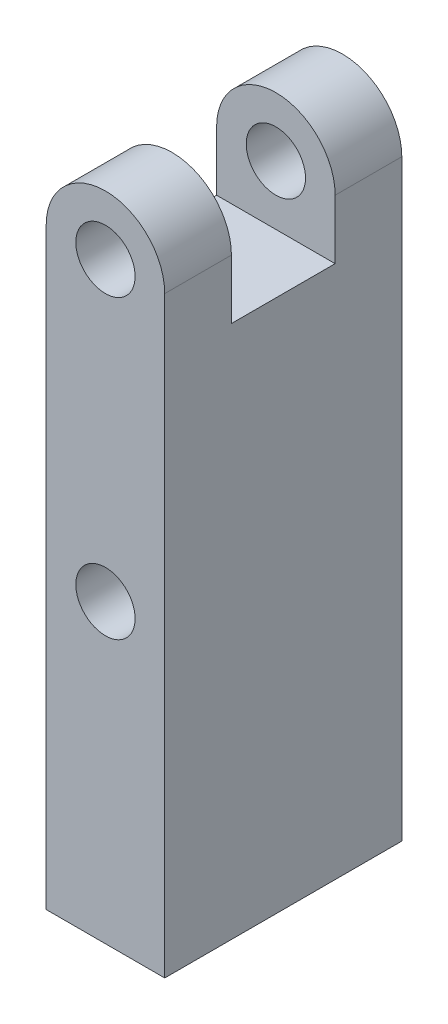
ISO-10303-21;
HEADER;
FILE_DESCRIPTION(('STEP AP214'),'2;1');
FILE_NAME('part.step','',(''),(''),'','','');
FILE_SCHEMA(('AUTOMOTIVE_DESIGN { 1 0 10303 214 1 1 1 1 }'));
ENDSEC;
DATA;
#1=APPLICATION_CONTEXT('core data for automotive mechanical design processes');
#2=APPLICATION_PROTOCOL_DEFINITION('international standard','automotive_design',2000,#1);
#3=PRODUCT_CONTEXT('',#1,'mechanical');
#4=PRODUCT('Part','Part','',(#3));
#5=PRODUCT_RELATED_PRODUCT_CATEGORY('part','',(#4));
#6=PRODUCT_DEFINITION_FORMATION('','',#4);
#7=PRODUCT_DEFINITION_CONTEXT('part definition',#1,'design');
#8=PRODUCT_DEFINITION('design','',#6,#7);
#9=PRODUCT_DEFINITION_SHAPE('','',#8);
#10=(LENGTH_UNIT() NAMED_UNIT(*) SI_UNIT(.MILLI.,.METRE.));
#11=(NAMED_UNIT(*) PLANE_ANGLE_UNIT() SI_UNIT($,.RADIAN.));
#12=(NAMED_UNIT(*) SI_UNIT($,.STERADIAN.) SOLID_ANGLE_UNIT());
#13=UNCERTAINTY_MEASURE_WITH_UNIT(LENGTH_MEASURE(1.E-05),#10,'distance_accuracy_value','');
#14=(GEOMETRIC_REPRESENTATION_CONTEXT(3) GLOBAL_UNCERTAINTY_ASSIGNED_CONTEXT((#13)) GLOBAL_UNIT_ASSIGNED_CONTEXT((#10,
#11,#12)) REPRESENTATION_CONTEXT('',''));
#15=CARTESIAN_POINT('',(0.,0.,0.));
#16=DIRECTION('',(0.,0.,1.));
#17=DIRECTION('',(1.,0.,0.));
#18=AXIS2_PLACEMENT_3D('',#15,#16,#17);
#19=CARTESIAN_POINT('',(-0.244261307550768,5.43627561659298,4.));
#20=DIRECTION('',(0.,0.,-1.));
#21=DIRECTION('',(-1.,0.,0.));
#22=AXIS2_PLACEMENT_3D('',#19,#20,#21);
#23=CYLINDRICAL_SURFACE('',#22,1.);
#24=DIRECTION('',(0.,0.,-1.));
#25=VECTOR('',#24,1.);
#26=CARTESIAN_POINT('',(0.755738692449232,5.43627561659298,4.));
#27=LINE('',#26,#25);
#28=CARTESIAN_POINT('',(0.755738692449232,5.43627561659298,4.));
#29=VERTEX_POINT('',#28);
#30=CARTESIAN_POINT('',(0.755738692449232,5.43627561659298,2.875));
#31=VERTEX_POINT('',#30);
#32=EDGE_CURVE('E115',#29,#31,#27,.T.);
#33=ORIENTED_EDGE('',*,*,#32,.T.);
#34=CARTESIAN_POINT('',(-0.244261307550768,5.43627561659298,2.875));
#35=DIRECTION('',(0.,0.,-1.));
#36=DIRECTION('',(0.,1.,0.));
#37=AXIS2_PLACEMENT_3D('',#34,#35,#36);
#38=CIRCLE('',#37,1.);
#39=CARTESIAN_POINT('',(-1.24426130755077,5.43627561659298,2.875));
#40=VERTEX_POINT('',#39);
#41=EDGE_CURVE('E135',#40,#31,#38,.T.);
#42=ORIENTED_EDGE('',*,*,#41,.F.);
#43=DIRECTION('',(0.,0.,-1.));
#44=VECTOR('',#43,1.);
#45=CARTESIAN_POINT('',(-1.24426130755077,5.43627561659298,4.));
#46=LINE('',#45,#44);
#47=CARTESIAN_POINT('',(-1.24426130755077,5.43627561659298,4.));
#48=VERTEX_POINT('',#47);
#49=EDGE_CURVE('E40',#48,#40,#46,.T.);
#50=ORIENTED_EDGE('',*,*,#49,.F.);
#51=CARTESIAN_POINT('',(-0.244261307550768,5.43627561659298,4.));
#52=DIRECTION('',(0.,0.,1.));
#53=DIRECTION('',(1.,0.,0.));
#54=AXIS2_PLACEMENT_3D('',#51,#52,#53);
#55=CIRCLE('',#54,1.);
#56=EDGE_CURVE('E152',#29,#48,#55,.T.);
#57=ORIENTED_EDGE('',*,*,#56,.F.);
#58=EDGE_LOOP('',(#33,#42,#50,#57));
#59=FACE_BOUND('',#58,.T.);
#60=ADVANCED_FACE('F33',(#59),#23,.T.);
#61=CARTESIAN_POINT('',(-0.244261307550768,5.43627561659298,1.125));
#62=DIRECTION('',(0.,0.,1.));
#63=DIRECTION('',(1.,0.,0.));
#64=AXIS2_PLACEMENT_3D('',#61,#62,#63);
#65=CIRCLE('',#64,1.);
#66=CARTESIAN_POINT('',(0.755738692449232,5.43627561659298,1.125));
#67=VERTEX_POINT('',#66);
#68=CARTESIAN_POINT('',(-1.24426130755077,5.43627561659298,1.125));
#69=VERTEX_POINT('',#68);
#70=EDGE_CURVE('E96',#67,#69,#65,.T.);
#71=ORIENTED_EDGE('',*,*,#70,.F.);
#72=CARTESIAN_POINT('',(0.755738692449232,5.43627561659298,0.));
#73=VERTEX_POINT('',#72);
#74=EDGE_CURVE('E100',#67,#73,#27,.T.);
#75=ORIENTED_EDGE('',*,*,#74,.T.);
#76=CARTESIAN_POINT('',(-0.244261307550768,5.43627561659298,0.));
#77=DIRECTION('',(0.,0.,1.));
#78=DIRECTION('',(1.,0.,0.));
#79=AXIS2_PLACEMENT_3D('',#76,#77,#78);
#80=CIRCLE('',#79,1.);
#81=CARTESIAN_POINT('',(-1.24426130755077,5.43627561659298,0.));
#82=VERTEX_POINT('',#81);
#83=EDGE_CURVE('E149',#73,#82,#80,.T.);
#84=ORIENTED_EDGE('',*,*,#83,.T.);
#85=EDGE_CURVE('E102',#69,#82,#46,.T.);
#86=ORIENTED_EDGE('',*,*,#85,.F.);
#87=EDGE_LOOP('',(#71,#75,#84,#86));
#88=FACE_BOUND('',#87,.T.);
#89=ADVANCED_FACE('F98',(#88),#23,.T.);
#90=CARTESIAN_POINT('',(-1.24426130755077,-4.56372438340702,4.));
#91=DIRECTION('',(1.,0.,0.));
#92=DIRECTION('',(0.,1.,0.));
#93=AXIS2_PLACEMENT_3D('',#90,#91,#92);
#94=PLANE('',#93);
#95=DIRECTION('',(0.,1.,0.));
#96=VECTOR('',#95,1.);
#97=CARTESIAN_POINT('',(-1.24426130755077,-4.56372438340702,2.875));
#98=LINE('',#97,#96);
#99=CARTESIAN_POINT('',(-1.24426130755077,4.43627561659299,2.875));
#100=VERTEX_POINT('',#99);
#101=EDGE_CURVE('E47',#100,#40,#98,.T.);
#102=ORIENTED_EDGE('',*,*,#101,.F.);
#103=DIRECTION('',(0.,0.,1.));
#104=VECTOR('',#103,1.);
#105=CARTESIAN_POINT('',(-1.24426130755077,4.43627561659299,4.));
#106=LINE('',#105,#104);
#107=CARTESIAN_POINT('',(-1.24426130755077,4.43627561659299,1.125));
#108=VERTEX_POINT('',#107);
#109=EDGE_CURVE('E51',#108,#100,#106,.T.);
#110=ORIENTED_EDGE('',*,*,#109,.F.);
#111=DIRECTION('',(0.,-1.,0.));
#112=VECTOR('',#111,1.);
#113=CARTESIAN_POINT('',(-1.24426130755077,-4.56372438340702,1.125));
#114=LINE('',#113,#112);
#115=EDGE_CURVE('E105',#69,#108,#114,.T.);
#116=ORIENTED_EDGE('',*,*,#115,.F.);
#117=ORIENTED_EDGE('',*,*,#85,.T.);
#118=DIRECTION('',(0.,-1.,0.));
#119=VECTOR('',#118,1.);
#120=CARTESIAN_POINT('',(-1.24426130755077,-4.56372438340702,0.));
#121=LINE('',#120,#119);
#122=CARTESIAN_POINT('',(-1.24426130755077,-4.56372438340702,0.));
#123=VERTEX_POINT('',#122);
#124=EDGE_CURVE('E161',#82,#123,#121,.T.);
#125=ORIENTED_EDGE('',*,*,#124,.T.);
#126=DIRECTION('',(0.,0.,-1.));
#127=VECTOR('',#126,1.);
#128=CARTESIAN_POINT('',(-1.24426130755077,-4.56372438340702,4.));
#129=LINE('',#128,#127);
#130=CARTESIAN_POINT('',(-1.24426130755077,-4.56372438340702,4.));
#131=VERTEX_POINT('',#130);
#132=EDGE_CURVE('E169',#131,#123,#129,.T.);
#133=ORIENTED_EDGE('',*,*,#132,.F.);
#134=DIRECTION('',(0.,-1.,0.));
#135=VECTOR('',#134,1.);
#136=CARTESIAN_POINT('',(-1.24426130755077,-4.56372438340702,4.));
#137=LINE('',#136,#135);
#138=EDGE_CURVE('E155',#48,#131,#137,.T.);
#139=ORIENTED_EDGE('',*,*,#138,.F.);
#140=ORIENTED_EDGE('',*,*,#49,.T.);
#141=EDGE_LOOP('',(#102,#110,#116,#117,#125,#133,#139,#140));
#142=FACE_BOUND('',#141,.T.);
#143=ADVANCED_FACE('F202',(#142),#94,.F.);
#144=CARTESIAN_POINT('',(0.755738692449232,-4.56372438340702,4.));
#145=DIRECTION('',(-1.,0.,0.));
#146=DIRECTION('',(0.,0.,1.));
#147=AXIS2_PLACEMENT_3D('',#144,#145,#146);
#148=PLANE('',#147);
#149=DIRECTION('',(0.,-1.,0.));
#150=VECTOR('',#149,1.);
#151=CARTESIAN_POINT('',(0.755738692449232,-4.56372438340702,2.875));
#152=LINE('',#151,#150);
#153=CARTESIAN_POINT('',(0.755738692449232,4.43627561659299,2.875));
#154=VERTEX_POINT('',#153);
#155=EDGE_CURVE('E132',#31,#154,#152,.T.);
#156=ORIENTED_EDGE('',*,*,#155,.F.);
#157=ORIENTED_EDGE('',*,*,#32,.F.);
#158=DIRECTION('',(0.,1.,0.));
#159=VECTOR('',#158,1.);
#160=CARTESIAN_POINT('',(0.755738692449232,-4.56372438340702,4.));
#161=LINE('',#160,#159);
#162=CARTESIAN_POINT('',(0.755738692449232,-4.56372438340702,4.));
#163=VERTEX_POINT('',#162);
#164=EDGE_CURVE('E116',#163,#29,#161,.T.);
#165=ORIENTED_EDGE('',*,*,#164,.F.);
#166=DIRECTION('',(0.,0.,-1.));
#167=VECTOR('',#166,1.);
#168=CARTESIAN_POINT('',(0.755738692449232,-4.56372438340702,4.));
#169=LINE('',#168,#167);
#170=CARTESIAN_POINT('',(0.755738692449232,-4.56372438340702,0.));
#171=VERTEX_POINT('',#170);
#172=EDGE_CURVE('E167',#163,#171,#169,.T.);
#173=ORIENTED_EDGE('',*,*,#172,.T.);
#174=DIRECTION('',(0.,1.,0.));
#175=VECTOR('',#174,1.);
#176=CARTESIAN_POINT('',(0.755738692449232,-4.56372438340702,0.));
#177=LINE('',#176,#175);
#178=EDGE_CURVE('E113',#171,#73,#177,.T.);
#179=ORIENTED_EDGE('',*,*,#178,.T.);
#180=ORIENTED_EDGE('',*,*,#74,.F.);
#181=DIRECTION('',(0.,1.,0.));
#182=VECTOR('',#181,1.);
#183=CARTESIAN_POINT('',(0.755738692449232,-4.56372438340702,1.125));
#184=LINE('',#183,#182);
#185=CARTESIAN_POINT('',(0.755738692449232,4.43627561659299,1.125));
#186=VERTEX_POINT('',#185);
#187=EDGE_CURVE('E106',#186,#67,#184,.T.);
#188=ORIENTED_EDGE('',*,*,#187,.F.);
#189=DIRECTION('',(0.,0.,-1.));
#190=VECTOR('',#189,1.);
#191=CARTESIAN_POINT('',(0.755738692449232,4.43627561659299,4.));
#192=LINE('',#191,#190);
#193=EDGE_CURVE('E11',#154,#186,#192,.T.);
#194=ORIENTED_EDGE('',*,*,#193,.F.);
#195=EDGE_LOOP('',(#156,#157,#165,#173,#179,#180,#188,#194));
#196=FACE_BOUND('',#195,.T.);
#197=ADVANCED_FACE('F110',(#196),#148,.F.);
#198=CARTESIAN_POINT('',(-0.244261307550768,5.43627561659298,4.));
#199=DIRECTION('',(0.,0.,-1.));
#200=DIRECTION('',(-1.,0.,0.));
#201=AXIS2_PLACEMENT_3D('',#198,#199,#200);
#202=CYLINDRICAL_SURFACE('',#201,0.500000000000001);
#203=CARTESIAN_POINT('',(-0.244261307550768,5.43627561659298,4.));
#204=DIRECTION('',(0.,0.,1.));
#205=DIRECTION('',(1.,0.,0.));
#206=AXIS2_PLACEMENT_3D('',#203,#204,#205);
#207=CIRCLE('',#206,0.500000000000001);
#208=CARTESIAN_POINT('',(0.255738692449233,5.43627561659298,4.));
#209=VERTEX_POINT('',#208);
#210=EDGE_CURVE('E146',#209,#209,#207,.T.);
#211=ORIENTED_EDGE('',*,*,#210,.T.);
#212=EDGE_LOOP('',(#211));
#213=FACE_BOUND('',#212,.T.);
#214=CARTESIAN_POINT('',(-0.244261307550768,5.43627561659298,2.875));
#215=DIRECTION('',(0.,0.,-1.));
#216=DIRECTION('',(0.,1.,0.));
#217=AXIS2_PLACEMENT_3D('',#214,#215,#216);
#218=CIRCLE('',#217,0.500000000000001);
#219=CARTESIAN_POINT('',(-0.244261307550768,5.93627561659299,2.875));
#220=VERTEX_POINT('',#219);
#221=EDGE_CURVE('E131',#220,#220,#218,.T.);
#222=ORIENTED_EDGE('',*,*,#221,.T.);
#223=EDGE_LOOP('',(#222));
#224=FACE_BOUND('',#223,.T.);
#225=ADVANCED_FACE('F175',(#213,#224),#202,.F.);
#226=CARTESIAN_POINT('',(-0.244261307550768,5.43627561659298,0.));
#227=DIRECTION('',(0.,0.,1.));
#228=DIRECTION('',(1.,0.,0.));
#229=AXIS2_PLACEMENT_3D('',#226,#227,#228);
#230=CIRCLE('',#229,0.500000000000001);
#231=CARTESIAN_POINT('',(0.255738692449233,5.43627561659298,0.));
#232=VERTEX_POINT('',#231);
#233=EDGE_CURVE('E143',#232,#232,#230,.T.);
#234=ORIENTED_EDGE('',*,*,#233,.F.);
#235=EDGE_LOOP('',(#234));
#236=FACE_BOUND('',#235,.T.);
#237=CARTESIAN_POINT('',(-0.244261307550768,5.43627561659298,1.125));
#238=DIRECTION('',(0.,0.,1.));
#239=DIRECTION('',(1.,0.,0.));
#240=AXIS2_PLACEMENT_3D('',#237,#238,#239);
#241=CIRCLE('',#240,0.500000000000001);
#242=CARTESIAN_POINT('',(0.255738692449233,5.43627561659298,1.125));
#243=VERTEX_POINT('',#242);
#244=EDGE_CURVE('E122',#243,#243,#241,.T.);
#245=ORIENTED_EDGE('',*,*,#244,.T.);
#246=EDGE_LOOP('',(#245));
#247=FACE_BOUND('',#246,.T.);
#248=ADVANCED_FACE('F228',(#236,#247),#202,.F.);
#249=CARTESIAN_POINT('',(-0.244261307550768,5.43627561659298,4.));
#250=DIRECTION('',(0.,0.,1.));
#251=DIRECTION('',(1.,0.,0.));
#252=AXIS2_PLACEMENT_3D('',#249,#250,#251);
#253=PLANE('',#252);
#254=ORIENTED_EDGE('',*,*,#210,.F.);
#255=EDGE_LOOP('',(#254));
#256=FACE_BOUND('',#255,.T.);
#257=ORIENTED_EDGE('',*,*,#56,.T.);
#258=ORIENTED_EDGE('',*,*,#138,.T.);
#259=DIRECTION('',(1.,0.,0.));
#260=VECTOR('',#259,1.);
#261=CARTESIAN_POINT('',(0.755738692449232,-4.56372438340702,4.));
#262=LINE('',#261,#260);
#263=EDGE_CURVE('E157',#131,#163,#262,.T.);
#264=ORIENTED_EDGE('',*,*,#263,.T.);
#265=ORIENTED_EDGE('',*,*,#164,.T.);
#266=EDGE_LOOP('',(#257,#258,#264,#265));
#267=FACE_BOUND('',#266,.T.);
#268=CARTESIAN_POINT('',(-0.244261307550769,0.436275616592984,4.));
#269=DIRECTION('',(0.,0.,1.));
#270=DIRECTION('',(1.,0.,0.));
#271=AXIS2_PLACEMENT_3D('',#268,#269,#270);
#272=CIRCLE('',#271,0.5);
#273=CARTESIAN_POINT('',(0.255738692449231,0.436275616592984,4.));
#274=VERTEX_POINT('',#273);
#275=EDGE_CURVE('E140',#274,#274,#272,.T.);
#276=ORIENTED_EDGE('',*,*,#275,.F.);
#277=EDGE_LOOP('',(#276));
#278=FACE_BOUND('',#277,.T.);
#279=ADVANCED_FACE('F191',(#256,#267,#278),#253,.T.);
#280=CARTESIAN_POINT('',(-0.244261307550768,5.43627561659298,0.));
#281=DIRECTION('',(0.,0.,1.));
#282=DIRECTION('',(1.,0.,0.));
#283=AXIS2_PLACEMENT_3D('',#280,#281,#282);
#284=PLANE('',#283);
#285=ORIENTED_EDGE('',*,*,#83,.F.);
#286=ORIENTED_EDGE('',*,*,#178,.F.);
#287=DIRECTION('',(1.,0.,0.));
#288=VECTOR('',#287,1.);
#289=CARTESIAN_POINT('',(0.755738692449232,-4.56372438340702,0.));
#290=LINE('',#289,#288);
#291=EDGE_CURVE('E163',#123,#171,#290,.T.);
#292=ORIENTED_EDGE('',*,*,#291,.F.);
#293=ORIENTED_EDGE('',*,*,#124,.F.);
#294=EDGE_LOOP('',(#285,#286,#292,#293));
#295=FACE_BOUND('',#294,.T.);
#296=ORIENTED_EDGE('',*,*,#233,.T.);
#297=EDGE_LOOP('',(#296));
#298=FACE_BOUND('',#297,.T.);
#299=CARTESIAN_POINT('',(-0.244261307550769,0.436275616592984,0.));
#300=DIRECTION('',(0.,0.,1.));
#301=DIRECTION('',(1.,0.,0.));
#302=AXIS2_PLACEMENT_3D('',#299,#300,#301);
#303=CIRCLE('',#302,0.5);
#304=CARTESIAN_POINT('',(0.255738692449231,0.436275616592984,0.));
#305=VERTEX_POINT('',#304);
#306=EDGE_CURVE('E139',#305,#305,#303,.T.);
#307=ORIENTED_EDGE('',*,*,#306,.T.);
#308=EDGE_LOOP('',(#307));
#309=FACE_BOUND('',#308,.T.);
#310=ADVANCED_FACE('F199',(#295,#298,#309),#284,.F.);
#311=CARTESIAN_POINT('',(0.755738692449232,-4.56372438340702,4.));
#312=DIRECTION('',(0.,1.,0.));
#313=DIRECTION('',(0.,0.,1.));
#314=AXIS2_PLACEMENT_3D('',#311,#312,#313);
#315=PLANE('',#314);
#316=ORIENTED_EDGE('',*,*,#291,.T.);
#317=ORIENTED_EDGE('',*,*,#172,.F.);
#318=ORIENTED_EDGE('',*,*,#263,.F.);
#319=ORIENTED_EDGE('',*,*,#132,.T.);
#320=EDGE_LOOP('',(#316,#317,#318,#319));
#321=FACE_BOUND('',#320,.T.);
#322=ADVANCED_FACE('F203',(#321),#315,.F.);
#323=CARTESIAN_POINT('',(-0.244261307550769,0.436275616592984,4.));
#324=DIRECTION('',(0.,0.,-1.));
#325=DIRECTION('',(-1.,0.,0.));
#326=AXIS2_PLACEMENT_3D('',#323,#324,#325);
#327=CYLINDRICAL_SURFACE('',#326,0.5);
#328=ORIENTED_EDGE('',*,*,#275,.T.);
#329=EDGE_LOOP('',(#328));
#330=FACE_BOUND('',#329,.T.);
#331=ORIENTED_EDGE('',*,*,#306,.F.);
#332=EDGE_LOOP('',(#331));
#333=FACE_BOUND('',#332,.T.);
#334=ADVANCED_FACE('F205',(#330,#333),#327,.F.);
#335=CARTESIAN_POINT('',(16.3982542432359,4.43627561659299,2.875));
#336=DIRECTION('',(0.,1.,0.));
#337=DIRECTION('',(0.,0.,1.));
#338=AXIS2_PLACEMENT_3D('',#335,#336,#337);
#339=PLANE('',#338);
#340=DIRECTION('',(-1.,0.,0.));
#341=VECTOR('',#340,1.);
#342=CARTESIAN_POINT('',(16.3982542432359,4.43627561659299,1.125));
#343=LINE('',#342,#341);
#344=EDGE_CURVE('E121',#186,#108,#343,.T.);
#345=ORIENTED_EDGE('',*,*,#344,.T.);
#346=ORIENTED_EDGE('',*,*,#109,.T.);
#347=DIRECTION('',(-1.,0.,0.));
#348=VECTOR('',#347,1.);
#349=CARTESIAN_POINT('',(16.3982542432359,4.43627561659299,2.875));
#350=LINE('',#349,#348);
#351=EDGE_CURVE('E125',#154,#100,#350,.T.);
#352=ORIENTED_EDGE('',*,*,#351,.F.);
#353=ORIENTED_EDGE('',*,*,#193,.T.);
#354=EDGE_LOOP('',(#345,#346,#352,#353));
#355=FACE_BOUND('',#354,.T.);
#356=ADVANCED_FACE('F180',(#355),#339,.T.);
#357=CARTESIAN_POINT('',(16.3982542432359,6.43627561659298,2.875));
#358=DIRECTION('',(0.,0.,-1.));
#359=DIRECTION('',(0.,1.,0.));
#360=AXIS2_PLACEMENT_3D('',#357,#358,#359);
#361=PLANE('',#360);
#362=ORIENTED_EDGE('',*,*,#221,.F.);
#363=EDGE_LOOP('',(#362));
#364=FACE_BOUND('',#363,.T.);
#365=ORIENTED_EDGE('',*,*,#351,.T.);
#366=ORIENTED_EDGE('',*,*,#101,.T.);
#367=ORIENTED_EDGE('',*,*,#41,.T.);
#368=ORIENTED_EDGE('',*,*,#155,.T.);
#369=EDGE_LOOP('',(#365,#366,#367,#368));
#370=FACE_BOUND('',#369,.T.);
#371=ADVANCED_FACE('F177',(#364,#370),#361,.T.);
#372=CARTESIAN_POINT('',(16.3982542432359,4.43627561659299,1.125));
#373=DIRECTION('',(0.,0.,1.));
#374=DIRECTION('',(1.,0.,0.));
#375=AXIS2_PLACEMENT_3D('',#372,#373,#374);
#376=PLANE('',#375);
#377=ORIENTED_EDGE('',*,*,#244,.F.);
#378=EDGE_LOOP('',(#377));
#379=FACE_BOUND('',#378,.T.);
#380=ORIENTED_EDGE('',*,*,#70,.T.);
#381=ORIENTED_EDGE('',*,*,#115,.T.);
#382=ORIENTED_EDGE('',*,*,#344,.F.);
#383=ORIENTED_EDGE('',*,*,#187,.T.);
#384=EDGE_LOOP('',(#380,#381,#382,#383));
#385=FACE_BOUND('',#384,.T.);
#386=ADVANCED_FACE('F119',(#379,#385),#376,.T.);
#387=CLOSED_SHELL('',(#60,#89,#143,#197,#225,#248,#279,#310,#322,#334,#356,#371,#386));
#388=MANIFOLD_SOLID_BREP('B2',#387);
#389=ADVANCED_BREP_SHAPE_REPRESENTATION('',(#18,#388),#14);
#390=SHAPE_DEFINITION_REPRESENTATION(#9,#389);
ENDSEC;
END-ISO-10303-21;
